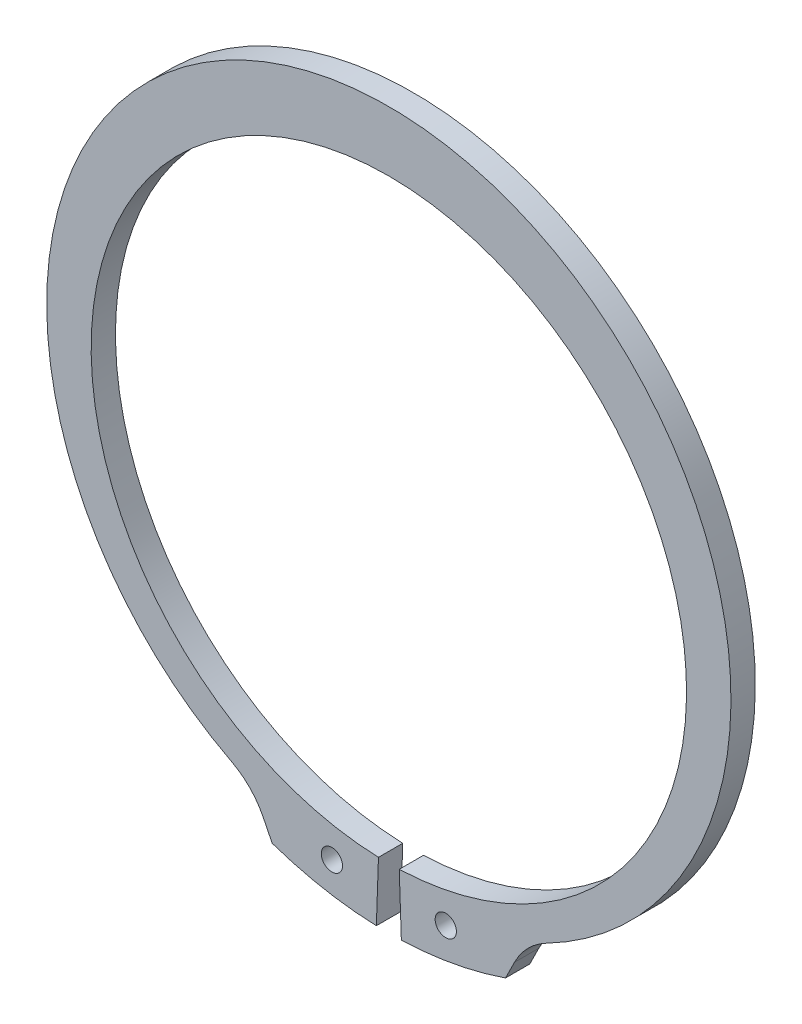
ISO-10303-21;
HEADER;
FILE_DESCRIPTION(('STEP AP214'),'2;1');
FILE_NAME('part.step','',(''),(''),'','','');
FILE_SCHEMA(('AUTOMOTIVE_DESIGN { 1 0 10303 214 1 1 1 1 }'));
ENDSEC;
DATA;
#1=APPLICATION_CONTEXT('core data for automotive mechanical design processes');
#2=APPLICATION_PROTOCOL_DEFINITION('international standard','automotive_design',2000,#1);
#3=PRODUCT_CONTEXT('',#1,'mechanical');
#4=PRODUCT('Part','Part','',(#3));
#5=PRODUCT_RELATED_PRODUCT_CATEGORY('part','',(#4));
#6=PRODUCT_DEFINITION_FORMATION('','',#4);
#7=PRODUCT_DEFINITION_CONTEXT('part definition',#1,'design');
#8=PRODUCT_DEFINITION('design','',#6,#7);
#9=PRODUCT_DEFINITION_SHAPE('','',#8);
#10=(LENGTH_UNIT() NAMED_UNIT(*) SI_UNIT(.MILLI.,.METRE.));
#11=(NAMED_UNIT(*) PLANE_ANGLE_UNIT() SI_UNIT($,.RADIAN.));
#12=(NAMED_UNIT(*) SI_UNIT($,.STERADIAN.) SOLID_ANGLE_UNIT());
#13=UNCERTAINTY_MEASURE_WITH_UNIT(LENGTH_MEASURE(1.E-05),#10,'distance_accuracy_value','');
#14=(GEOMETRIC_REPRESENTATION_CONTEXT(3) GLOBAL_UNCERTAINTY_ASSIGNED_CONTEXT((#13)) GLOBAL_UNIT_ASSIGNED_CONTEXT((#10,
#11,#12)) REPRESENTATION_CONTEXT('',''));
#15=CARTESIAN_POINT('',(0.,0.,0.));
#16=DIRECTION('',(0.,0.,1.));
#17=DIRECTION('',(1.,0.,0.));
#18=AXIS2_PLACEMENT_3D('',#15,#16,#17);
#19=CARTESIAN_POINT('',(0.,2.58808801190562,2.));
#20=DIRECTION('',(0.,0.,1.));
#21=DIRECTION('',(1.,0.,0.));
#22=AXIS2_PLACEMENT_3D('',#19,#20,#21);
#23=PLANE('',#22);
#24=CARTESIAN_POINT('',(0.,2.58808801190562,2.));
#25=DIRECTION('',(0.,0.,1.));
#26=DIRECTION('',(1.,0.,0.));
#27=AXIS2_PLACEMENT_3D('',#24,#25,#26);
#28=CIRCLE('',#27,56.3119119880944);
#29=CARTESIAN_POINT('',(25.9258967268462,-47.4007038385062,2.));
#30=VERTEX_POINT('',#29);
#31=CARTESIAN_POINT('',(-25.9258967268462,-47.4007038385061,2.));
#32=VERTEX_POINT('',#31);
#33=EDGE_CURVE('E190',#30,#32,#28,.T.);
#34=ORIENTED_EDGE('',*,*,#33,.T.);
#35=CARTESIAN_POINT('',(-31.4686130929184,-58.0878440994076,2.));
#36=DIRECTION('',(0.,0.,1.));
#37=DIRECTION('',(1.,0.,0.));
#38=AXIS2_PLACEMENT_3D('',#35,#36,#37);
#39=CIRCLE('',#38,12.0389647258768);
#40=CARTESIAN_POINT('',(-20.689117341392,-52.7269539668149,2.));
#41=VERTEX_POINT('',#40);
#42=EDGE_CURVE('E12',#32,#41,#39,.F.);
#43=ORIENTED_EDGE('',*,*,#42,.T.);
#44=DIRECTION('',(0.445294944761314,-0.895383946790436,0.));
#45=VECTOR('',#44,1.);
#46=CARTESIAN_POINT('',(-19.2002900297878,-55.7206373446221,2.));
#47=LINE('',#46,#45);
#48=CARTESIAN_POINT('',(-19.2002900297878,-55.7206373446221,2.));
#49=VERTEX_POINT('',#48);
#50=EDGE_CURVE('E193',#41,#49,#47,.T.);
#51=ORIENTED_EDGE('',*,*,#50,.T.);
#52=CARTESIAN_POINT('',(0.,0.,2.));
#53=DIRECTION('',(0.,0.,1.));
#54=DIRECTION('',(1.,0.,0.));
#55=AXIS2_PLACEMENT_3D('',#52,#53,#54);
#56=CIRCLE('',#55,58.9359021592006);
#57=CARTESIAN_POINT('',(-2.05683332306393,-58.9,2.));
#58=VERTEX_POINT('',#57);
#59=EDGE_CURVE('E197',#49,#58,#56,.T.);
#60=ORIENTED_EDGE('',*,*,#59,.T.);
#61=DIRECTION('',(0.0348994967024932,0.999390827019096,0.));
#62=VECTOR('',#61,1.);
#63=CARTESIAN_POINT('',(-2.05683332306393,-58.9,2.));
#64=LINE('',#63,#62);
#65=CARTESIAN_POINT('',(-1.71007533842262,-48.9701505239357,2.));
#66=VERTEX_POINT('',#65);
#67=EDGE_CURVE('E200',#58,#66,#64,.T.);
#68=ORIENTED_EDGE('',*,*,#67,.T.);
#69=CARTESIAN_POINT('',(0.,0.,2.));
#70=DIRECTION('',(0.,0.,-1.));
#71=DIRECTION('',(1.,0.,0.));
#72=AXIS2_PLACEMENT_3D('',#69,#70,#71);
#73=CIRCLE('',#72,49.);
#74=CARTESIAN_POINT('',(1.71007533842259,-48.9701505239357,2.));
#75=VERTEX_POINT('',#74);
#76=EDGE_CURVE('E203',#66,#75,#73,.T.);
#77=ORIENTED_EDGE('',*,*,#76,.T.);
#78=DIRECTION('',(-0.0348994967024925,0.999390827019096,0.));
#79=VECTOR('',#78,1.);
#80=CARTESIAN_POINT('',(2.05683332306389,-58.9,2.));
#81=LINE('',#80,#79);
#82=CARTESIAN_POINT('',(2.05683332306389,-58.9,2.));
#83=VERTEX_POINT('',#82);
#84=EDGE_CURVE('E145',#83,#75,#81,.T.);
#85=ORIENTED_EDGE('',*,*,#84,.F.);
#86=CARTESIAN_POINT('',(0.,0.,2.));
#87=DIRECTION('',(0.,0.,-1.));
#88=DIRECTION('',(-1.,0.,0.));
#89=AXIS2_PLACEMENT_3D('',#86,#87,#88);
#90=CIRCLE('',#89,58.9359021592006);
#91=CARTESIAN_POINT('',(19.2002900297878,-55.7206373446221,2.));
#92=VERTEX_POINT('',#91);
#93=EDGE_CURVE('E123',#92,#83,#90,.T.);
#94=ORIENTED_EDGE('',*,*,#93,.F.);
#95=DIRECTION('',(-0.445294944761315,-0.895383946790436,0.));
#96=VECTOR('',#95,1.);
#97=CARTESIAN_POINT('',(19.2002900297878,-55.7206373446221,2.));
#98=LINE('',#97,#96);
#99=CARTESIAN_POINT('',(20.6891173413919,-52.7269539668149,2.));
#100=VERTEX_POINT('',#99);
#101=EDGE_CURVE('E135',#100,#92,#98,.T.);
#102=ORIENTED_EDGE('',*,*,#101,.F.);
#103=CARTESIAN_POINT('',(31.4686130929183,-58.0878440994076,2.));
#104=DIRECTION('',(0.,0.,-1.));
#105=DIRECTION('',(-1.,0.,0.));
#106=AXIS2_PLACEMENT_3D('',#103,#104,#105);
#107=CIRCLE('',#106,12.0389647258768);
#108=EDGE_CURVE('E178',#30,#100,#107,.F.);
#109=ORIENTED_EDGE('',*,*,#108,.F.);
#110=EDGE_LOOP('',(#34,#43,#51,#60,#68,#77,#85,#94,#102,#109));
#111=FACE_BOUND('',#110,.T.);
#112=CARTESIAN_POINT('',(-9.37143635739027,-53.148056637374,2.));
#113=DIRECTION('',(0.,0.,1.));
#114=DIRECTION('',(1.,0.,0.));
#115=AXIS2_PLACEMENT_3D('',#112,#113,#114);
#116=CIRCLE('',#115,1.75);
#117=CARTESIAN_POINT('',(-7.62143635739026,-53.148056637374,2.));
#118=VERTEX_POINT('',#117);
#119=EDGE_CURVE('E182',#118,#118,#116,.T.);
#120=ORIENTED_EDGE('',*,*,#119,.F.);
#121=EDGE_LOOP('',(#120));
#122=FACE_BOUND('',#121,.T.);
#123=CARTESIAN_POINT('',(9.37143635739023,-53.148056637374,2.));
#124=DIRECTION('',(0.,0.,-1.));
#125=DIRECTION('',(-1.,0.,0.));
#126=AXIS2_PLACEMENT_3D('',#123,#124,#125);
#127=CIRCLE('',#126,1.75);
#128=CARTESIAN_POINT('',(7.62143635739023,-53.148056637374,2.));
#129=VERTEX_POINT('',#128);
#130=EDGE_CURVE('E157',#129,#129,#127,.T.);
#131=ORIENTED_EDGE('',*,*,#130,.T.);
#132=EDGE_LOOP('',(#131));
#133=FACE_BOUND('',#132,.T.);
#134=ADVANCED_FACE('F43',(#111,#122,#133),#23,.T.);
#135=CARTESIAN_POINT('',(0.,2.58808801190562,-2.));
#136=DIRECTION('',(0.,0.,1.));
#137=DIRECTION('',(1.,0.,0.));
#138=AXIS2_PLACEMENT_3D('',#135,#136,#137);
#139=PLANE('',#138);
#140=CARTESIAN_POINT('',(0.,2.58808801190562,-2.));
#141=DIRECTION('',(0.,0.,1.));
#142=DIRECTION('',(1.,0.,0.));
#143=AXIS2_PLACEMENT_3D('',#140,#141,#142);
#144=CIRCLE('',#143,56.3119119880944);
#145=CARTESIAN_POINT('',(25.9258967268462,-47.4007038385062,-2.));
#146=VERTEX_POINT('',#145);
#147=CARTESIAN_POINT('',(-25.9258967268462,-47.4007038385061,-2.));
#148=VERTEX_POINT('',#147);
#149=EDGE_CURVE('E186',#146,#148,#144,.T.);
#150=ORIENTED_EDGE('',*,*,#149,.F.);
#151=CARTESIAN_POINT('',(31.4686130929183,-58.0878440994076,-2.));
#152=DIRECTION('',(0.,0.,-1.));
#153=DIRECTION('',(-1.,0.,0.));
#154=AXIS2_PLACEMENT_3D('',#151,#152,#153);
#155=CIRCLE('',#154,12.0389647258768);
#156=CARTESIAN_POINT('',(20.6891173413919,-52.7269539668149,-2.));
#157=VERTEX_POINT('',#156);
#158=EDGE_CURVE('E174',#157,#146,#155,.T.);
#159=ORIENTED_EDGE('',*,*,#158,.F.);
#160=DIRECTION('',(-0.445294944761315,-0.895383946790436,0.));
#161=VECTOR('',#160,1.);
#162=CARTESIAN_POINT('',(19.2002900297878,-55.7206373446221,-2.));
#163=LINE('',#162,#161);
#164=CARTESIAN_POINT('',(19.2002900297878,-55.7206373446221,-2.));
#165=VERTEX_POINT('',#164);
#166=EDGE_CURVE('E154',#157,#165,#163,.T.);
#167=ORIENTED_EDGE('',*,*,#166,.T.);
#168=CARTESIAN_POINT('',(0.,0.,-2.));
#169=DIRECTION('',(0.,0.,-1.));
#170=DIRECTION('',(-1.,0.,0.));
#171=AXIS2_PLACEMENT_3D('',#168,#169,#170);
#172=CIRCLE('',#171,58.9359021592006);
#173=CARTESIAN_POINT('',(2.05683332306389,-58.9,-2.));
#174=VERTEX_POINT('',#173);
#175=EDGE_CURVE('E126',#165,#174,#172,.T.);
#176=ORIENTED_EDGE('',*,*,#175,.T.);
#177=DIRECTION('',(-0.0348994967024925,0.999390827019096,0.));
#178=VECTOR('',#177,1.);
#179=CARTESIAN_POINT('',(2.05683332306389,-58.9,-2.));
#180=LINE('',#179,#178);
#181=CARTESIAN_POINT('',(1.71007533842259,-48.9701505239357,-2.));
#182=VERTEX_POINT('',#181);
#183=EDGE_CURVE('E141',#174,#182,#180,.T.);
#184=ORIENTED_EDGE('',*,*,#183,.T.);
#185=CARTESIAN_POINT('',(0.,0.,-2.));
#186=DIRECTION('',(0.,0.,-1.));
#187=DIRECTION('',(1.,0.,0.));
#188=AXIS2_PLACEMENT_3D('',#185,#186,#187);
#189=CIRCLE('',#188,49.);
#190=CARTESIAN_POINT('',(-1.71007533842262,-48.9701505239357,-2.));
#191=VERTEX_POINT('',#190);
#192=EDGE_CURVE('E194',#191,#182,#189,.T.);
#193=ORIENTED_EDGE('',*,*,#192,.F.);
#194=DIRECTION('',(0.0348994967024932,0.999390827019096,0.));
#195=VECTOR('',#194,1.);
#196=CARTESIAN_POINT('',(-2.05683332306393,-58.9,-2.));
#197=LINE('',#196,#195);
#198=CARTESIAN_POINT('',(-2.05683332306393,-58.9,-2.));
#199=VERTEX_POINT('',#198);
#200=EDGE_CURVE('E215',#199,#191,#197,.T.);
#201=ORIENTED_EDGE('',*,*,#200,.F.);
#202=CARTESIAN_POINT('',(0.,0.,-2.));
#203=DIRECTION('',(0.,0.,1.));
#204=DIRECTION('',(1.,0.,0.));
#205=AXIS2_PLACEMENT_3D('',#202,#203,#204);
#206=CIRCLE('',#205,58.9359021592006);
#207=CARTESIAN_POINT('',(-19.2002900297878,-55.7206373446221,-2.));
#208=VERTEX_POINT('',#207);
#209=EDGE_CURVE('E212',#208,#199,#206,.T.);
#210=ORIENTED_EDGE('',*,*,#209,.F.);
#211=DIRECTION('',(0.445294944761314,-0.895383946790436,0.));
#212=VECTOR('',#211,1.);
#213=CARTESIAN_POINT('',(-19.2002900297878,-55.7206373446221,-2.));
#214=LINE('',#213,#212);
#215=CARTESIAN_POINT('',(-20.689117341392,-52.7269539668149,-2.));
#216=VERTEX_POINT('',#215);
#217=EDGE_CURVE('E209',#216,#208,#214,.T.);
#218=ORIENTED_EDGE('',*,*,#217,.F.);
#219=CARTESIAN_POINT('',(-31.4686130929184,-58.0878440994076,-2.));
#220=DIRECTION('',(0.,0.,1.));
#221=DIRECTION('',(1.,0.,0.));
#222=AXIS2_PLACEMENT_3D('',#219,#220,#221);
#223=CIRCLE('',#222,12.0389647258768);
#224=EDGE_CURVE('E52',#216,#148,#223,.T.);
#225=ORIENTED_EDGE('',*,*,#224,.T.);
#226=EDGE_LOOP('',(#150,#159,#167,#176,#184,#193,#201,#210,#218,#225));
#227=FACE_BOUND('',#226,.T.);
#228=CARTESIAN_POINT('',(-9.37143635739027,-53.148056637374,-2.));
#229=DIRECTION('',(0.,0.,1.));
#230=DIRECTION('',(1.,0.,0.));
#231=AXIS2_PLACEMENT_3D('',#228,#229,#230);
#232=CIRCLE('',#231,1.75);
#233=CARTESIAN_POINT('',(-7.62143635739026,-53.148056637374,-2.));
#234=VERTEX_POINT('',#233);
#235=EDGE_CURVE('E181',#234,#234,#232,.T.);
#236=ORIENTED_EDGE('',*,*,#235,.T.);
#237=EDGE_LOOP('',(#236));
#238=FACE_BOUND('',#237,.T.);
#239=CARTESIAN_POINT('',(9.37143635739023,-53.148056637374,-2.));
#240=DIRECTION('',(0.,0.,-1.));
#241=DIRECTION('',(-1.,0.,0.));
#242=AXIS2_PLACEMENT_3D('',#239,#240,#241);
#243=CIRCLE('',#242,1.75);
#244=CARTESIAN_POINT('',(7.62143635739023,-53.148056637374,-2.));
#245=VERTEX_POINT('',#244);
#246=EDGE_CURVE('E427',#245,#245,#243,.T.);
#247=ORIENTED_EDGE('',*,*,#246,.F.);
#248=EDGE_LOOP('',(#247));
#249=FACE_BOUND('',#248,.T.);
#250=ADVANCED_FACE('F272',(#227,#238,#249),#139,.F.);
#251=CARTESIAN_POINT('',(0.,2.58808801190562,2.));
#252=DIRECTION('',(0.,0.,-1.));
#253=DIRECTION('',(-1.,0.,0.));
#254=AXIS2_PLACEMENT_3D('',#251,#252,#253);
#255=CYLINDRICAL_SURFACE('',#254,56.3119119880944);
#256=ORIENTED_EDGE('',*,*,#149,.T.);
#257=DIRECTION('',(0.,0.,-1.));
#258=VECTOR('',#257,1.);
#259=CARTESIAN_POINT('',(-25.9258967268462,-47.4007038385062,2.));
#260=LINE('',#259,#258);
#261=EDGE_CURVE('E59',#148,#32,#260,.F.);
#262=ORIENTED_EDGE('',*,*,#261,.T.);
#263=ORIENTED_EDGE('',*,*,#33,.F.);
#264=DIRECTION('',(0.,0.,-1.));
#265=VECTOR('',#264,1.);
#266=CARTESIAN_POINT('',(25.9258967268462,-47.4007038385062,2.));
#267=LINE('',#266,#265);
#268=EDGE_CURVE('E170',#146,#30,#267,.F.);
#269=ORIENTED_EDGE('',*,*,#268,.F.);
#270=EDGE_LOOP('',(#256,#262,#263,#269));
#271=FACE_BOUND('',#270,.T.);
#272=ADVANCED_FACE('F301',(#271),#255,.T.);
#273=CARTESIAN_POINT('',(-19.2002900297878,-55.7206373446221,2.));
#274=DIRECTION('',(0.895383946790436,0.445294944761314,0.));
#275=DIRECTION('',(-0.445294944761314,0.895383946790436,0.));
#276=AXIS2_PLACEMENT_3D('',#273,#274,#275);
#277=PLANE('',#276);
#278=ORIENTED_EDGE('',*,*,#50,.F.);
#279=DIRECTION('',(0.,0.,1.));
#280=VECTOR('',#279,1.);
#281=CARTESIAN_POINT('',(-20.689117341392,-52.7269539668149,-2.));
#282=LINE('',#281,#280);
#283=EDGE_CURVE('E231',#41,#216,#282,.F.);
#284=ORIENTED_EDGE('',*,*,#283,.T.);
#285=ORIENTED_EDGE('',*,*,#217,.T.);
#286=DIRECTION('',(0.,0.,-1.));
#287=VECTOR('',#286,1.);
#288=CARTESIAN_POINT('',(-19.2002900297878,-55.7206373446221,2.));
#289=LINE('',#288,#287);
#290=EDGE_CURVE('E227',#49,#208,#289,.T.);
#291=ORIENTED_EDGE('',*,*,#290,.F.);
#292=EDGE_LOOP('',(#278,#284,#285,#291));
#293=FACE_BOUND('',#292,.T.);
#294=ADVANCED_FACE('F267',(#293),#277,.F.);
#295=CARTESIAN_POINT('',(0.,0.,2.));
#296=DIRECTION('',(0.,0.,-1.));
#297=DIRECTION('',(-1.,0.,0.));
#298=AXIS2_PLACEMENT_3D('',#295,#296,#297);
#299=CYLINDRICAL_SURFACE('',#298,58.9359021592006);
#300=ORIENTED_EDGE('',*,*,#209,.T.);
#301=DIRECTION('',(0.,0.,-1.));
#302=VECTOR('',#301,1.);
#303=CARTESIAN_POINT('',(-2.05683332306393,-58.9,2.));
#304=LINE('',#303,#302);
#305=EDGE_CURVE('E223',#58,#199,#304,.T.);
#306=ORIENTED_EDGE('',*,*,#305,.F.);
#307=ORIENTED_EDGE('',*,*,#59,.F.);
#308=ORIENTED_EDGE('',*,*,#290,.T.);
#309=EDGE_LOOP('',(#300,#306,#307,#308));
#310=FACE_BOUND('',#309,.T.);
#311=ADVANCED_FACE('F278',(#310),#299,.T.);
#312=CARTESIAN_POINT('',(-2.05683332306393,-58.9,2.));
#313=DIRECTION('',(-0.999390827019096,0.0348994967024932,0.));
#314=DIRECTION('',(-0.0348994967024932,-0.999390827019096,0.));
#315=AXIS2_PLACEMENT_3D('',#312,#313,#314);
#316=PLANE('',#315);
#317=ORIENTED_EDGE('',*,*,#200,.T.);
#318=DIRECTION('',(0.,0.,-1.));
#319=VECTOR('',#318,1.);
#320=CARTESIAN_POINT('',(-1.71007533842262,-48.9701505239357,2.));
#321=LINE('',#320,#319);
#322=EDGE_CURVE('E206',#66,#191,#321,.T.);
#323=ORIENTED_EDGE('',*,*,#322,.F.);
#324=ORIENTED_EDGE('',*,*,#67,.F.);
#325=ORIENTED_EDGE('',*,*,#305,.T.);
#326=EDGE_LOOP('',(#317,#323,#324,#325));
#327=FACE_BOUND('',#326,.T.);
#328=ADVANCED_FACE('F282',(#327),#316,.F.);
#329=CARTESIAN_POINT('',(0.,0.,2.));
#330=DIRECTION('',(0.,0.,-1.));
#331=DIRECTION('',(-1.,0.,0.));
#332=AXIS2_PLACEMENT_3D('',#329,#330,#331);
#333=CYLINDRICAL_SURFACE('',#332,49.);
#334=ORIENTED_EDGE('',*,*,#192,.T.);
#335=DIRECTION('',(0.,0.,-1.));
#336=VECTOR('',#335,1.);
#337=CARTESIAN_POINT('',(1.71007533842259,-48.9701505239357,2.));
#338=LINE('',#337,#336);
#339=EDGE_CURVE('E150',#75,#182,#338,.T.);
#340=ORIENTED_EDGE('',*,*,#339,.F.);
#341=ORIENTED_EDGE('',*,*,#76,.F.);
#342=ORIENTED_EDGE('',*,*,#322,.T.);
#343=EDGE_LOOP('',(#334,#340,#341,#342));
#344=FACE_BOUND('',#343,.T.);
#345=ADVANCED_FACE('F293',(#344),#333,.F.);
#346=CARTESIAN_POINT('',(-9.37143635739027,-53.148056637374,2.));
#347=DIRECTION('',(0.,0.,-1.));
#348=DIRECTION('',(-1.,0.,0.));
#349=AXIS2_PLACEMENT_3D('',#346,#347,#348);
#350=CYLINDRICAL_SURFACE('',#349,1.75);
#351=ORIENTED_EDGE('',*,*,#119,.T.);
#352=EDGE_LOOP('',(#351));
#353=FACE_BOUND('',#352,.T.);
#354=ORIENTED_EDGE('',*,*,#235,.F.);
#355=EDGE_LOOP('',(#354));
#356=FACE_BOUND('',#355,.T.);
#357=ADVANCED_FACE('F287',(#353,#356),#350,.F.);
#358=CARTESIAN_POINT('',(-31.4686130929184,-58.0878440994076,2.));
#359=DIRECTION('',(0.,0.,-1.));
#360=DIRECTION('',(-1.,0.,0.));
#361=AXIS2_PLACEMENT_3D('',#358,#359,#360);
#362=CYLINDRICAL_SURFACE('',#361,12.0389647258768);
#363=ORIENTED_EDGE('',*,*,#42,.F.);
#364=ORIENTED_EDGE('',*,*,#261,.F.);
#365=ORIENTED_EDGE('',*,*,#224,.F.);
#366=ORIENTED_EDGE('',*,*,#283,.F.);
#367=EDGE_LOOP('',(#363,#364,#365,#366));
#368=FACE_BOUND('',#367,.T.);
#369=ADVANCED_FACE('F45',(#368),#362,.F.);
#370=CARTESIAN_POINT('',(19.2002900297878,-55.7206373446221,2.));
#371=DIRECTION('',(-0.895383946790436,0.445294944761315,0.));
#372=DIRECTION('',(0.445294944761315,0.895383946790436,0.));
#373=AXIS2_PLACEMENT_3D('',#370,#371,#372);
#374=PLANE('',#373);
#375=ORIENTED_EDGE('',*,*,#101,.T.);
#376=DIRECTION('',(0.,0.,-1.));
#377=VECTOR('',#376,1.);
#378=CARTESIAN_POINT('',(19.2002900297878,-55.7206373446221,2.));
#379=LINE('',#378,#377);
#380=EDGE_CURVE('E119',#92,#165,#379,.T.);
#381=ORIENTED_EDGE('',*,*,#380,.T.);
#382=ORIENTED_EDGE('',*,*,#166,.F.);
#383=DIRECTION('',(0.,0.,1.));
#384=VECTOR('',#383,1.);
#385=CARTESIAN_POINT('',(20.6891173413919,-52.7269539668149,-2.));
#386=LINE('',#385,#384);
#387=EDGE_CURVE('E131',#100,#157,#386,.F.);
#388=ORIENTED_EDGE('',*,*,#387,.F.);
#389=EDGE_LOOP('',(#375,#381,#382,#388));
#390=FACE_BOUND('',#389,.T.);
#391=ADVANCED_FACE('F136',(#390),#374,.F.);
#392=CARTESIAN_POINT('',(0.,0.,2.));
#393=DIRECTION('',(0.,0.,-1.));
#394=DIRECTION('',(1.,0.,0.));
#395=AXIS2_PLACEMENT_3D('',#392,#393,#394);
#396=CYLINDRICAL_SURFACE('',#395,58.9359021592006);
#397=ORIENTED_EDGE('',*,*,#175,.F.);
#398=ORIENTED_EDGE('',*,*,#380,.F.);
#399=ORIENTED_EDGE('',*,*,#93,.T.);
#400=DIRECTION('',(0.,0.,-1.));
#401=VECTOR('',#400,1.);
#402=CARTESIAN_POINT('',(2.05683332306389,-58.9,2.));
#403=LINE('',#402,#401);
#404=EDGE_CURVE('E132',#83,#174,#403,.T.);
#405=ORIENTED_EDGE('',*,*,#404,.T.);
#406=EDGE_LOOP('',(#397,#398,#399,#405));
#407=FACE_BOUND('',#406,.T.);
#408=ADVANCED_FACE('F121',(#407),#396,.T.);
#409=CARTESIAN_POINT('',(2.05683332306389,-58.9,2.));
#410=DIRECTION('',(0.999390827019096,0.0348994967024925,0.));
#411=DIRECTION('',(0.0348994967024925,-0.999390827019096,0.));
#412=AXIS2_PLACEMENT_3D('',#409,#410,#411);
#413=PLANE('',#412);
#414=ORIENTED_EDGE('',*,*,#183,.F.);
#415=ORIENTED_EDGE('',*,*,#404,.F.);
#416=ORIENTED_EDGE('',*,*,#84,.T.);
#417=ORIENTED_EDGE('',*,*,#339,.T.);
#418=EDGE_LOOP('',(#414,#415,#416,#417));
#419=FACE_BOUND('',#418,.T.);
#420=ADVANCED_FACE('F325',(#419),#413,.F.);
#421=CARTESIAN_POINT('',(9.37143635739023,-53.148056637374,2.));
#422=DIRECTION('',(0.,0.,-1.));
#423=DIRECTION('',(1.,0.,0.));
#424=AXIS2_PLACEMENT_3D('',#421,#422,#423);
#425=CYLINDRICAL_SURFACE('',#424,1.75);
#426=ORIENTED_EDGE('',*,*,#130,.F.);
#427=EDGE_LOOP('',(#426));
#428=FACE_BOUND('',#427,.T.);
#429=ORIENTED_EDGE('',*,*,#246,.T.);
#430=EDGE_LOOP('',(#429));
#431=FACE_BOUND('',#430,.T.);
#432=ADVANCED_FACE('F321',(#428,#431),#425,.F.);
#433=CARTESIAN_POINT('',(31.4686130929183,-58.0878440994076,2.));
#434=DIRECTION('',(0.,0.,-1.));
#435=DIRECTION('',(1.,0.,0.));
#436=AXIS2_PLACEMENT_3D('',#433,#434,#435);
#437=CYLINDRICAL_SURFACE('',#436,12.0389647258768);
#438=ORIENTED_EDGE('',*,*,#108,.T.);
#439=ORIENTED_EDGE('',*,*,#387,.T.);
#440=ORIENTED_EDGE('',*,*,#158,.T.);
#441=ORIENTED_EDGE('',*,*,#268,.T.);
#442=EDGE_LOOP('',(#438,#439,#440,#441));
#443=FACE_BOUND('',#442,.T.);
#444=ADVANCED_FACE('F319',(#443),#437,.F.);
#445=CLOSED_SHELL('',(#134,#250,#272,#294,#311,#328,#345,#357,#369,#391,#408,#420,#432,#444));
#446=MANIFOLD_SOLID_BREP('B2',#445);
#447=ADVANCED_BREP_SHAPE_REPRESENTATION('',(#18,#446),#14);
#448=SHAPE_DEFINITION_REPRESENTATION(#9,#447);
ENDSEC;
END-ISO-10303-21;
